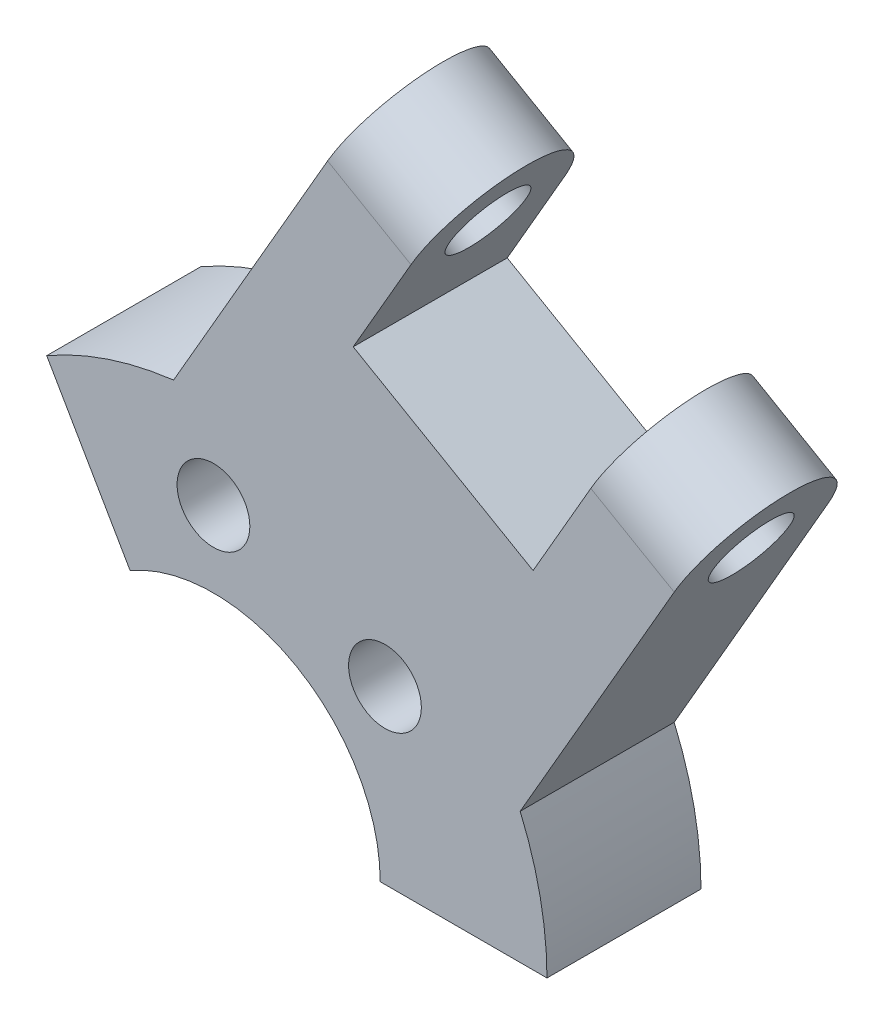
ISO-10303-21;
HEADER;
FILE_DESCRIPTION(('STEP AP214'),'2;1');
FILE_NAME('part.step','',(''),(''),'','','');
FILE_SCHEMA(('AUTOMOTIVE_DESIGN { 1 0 10303 214 1 1 1 1 }'));
ENDSEC;
DATA;
#1=APPLICATION_CONTEXT('core data for automotive mechanical design processes');
#2=APPLICATION_PROTOCOL_DEFINITION('international standard','automotive_design',2000,#1);
#3=PRODUCT_CONTEXT('',#1,'mechanical');
#4=PRODUCT('Part','Part','',(#3));
#5=PRODUCT_RELATED_PRODUCT_CATEGORY('part','',(#4));
#6=PRODUCT_DEFINITION_FORMATION('','',#4);
#7=PRODUCT_DEFINITION_CONTEXT('part definition',#1,'design');
#8=PRODUCT_DEFINITION('design','',#6,#7);
#9=PRODUCT_DEFINITION_SHAPE('','',#8);
#10=(LENGTH_UNIT() NAMED_UNIT(*) SI_UNIT(.MILLI.,.METRE.));
#11=(NAMED_UNIT(*) PLANE_ANGLE_UNIT() SI_UNIT($,.RADIAN.));
#12=(NAMED_UNIT(*) SI_UNIT($,.STERADIAN.) SOLID_ANGLE_UNIT());
#13=UNCERTAINTY_MEASURE_WITH_UNIT(LENGTH_MEASURE(1.E-05),#10,'distance_accuracy_value','');
#14=(GEOMETRIC_REPRESENTATION_CONTEXT(3) GLOBAL_UNCERTAINTY_ASSIGNED_CONTEXT((#13)) GLOBAL_UNIT_ASSIGNED_CONTEXT((#10,
#11,#12)) REPRESENTATION_CONTEXT('',''));
#15=CARTESIAN_POINT('',(0.,0.,0.));
#16=DIRECTION('',(0.,0.,1.));
#17=DIRECTION('',(1.,0.,0.));
#18=AXIS2_PLACEMENT_3D('',#15,#16,#17);
#19=CARTESIAN_POINT('',(0.,0.,10.17));
#20=DIRECTION('',(0.,-1.,0.));
#21=DIRECTION('',(0.,0.,-1.));
#22=AXIS2_PLACEMENT_3D('',#19,#20,#21);
#23=PLANE('',#22);
#24=DIRECTION('',(1.,0.,0.));
#25=VECTOR('',#24,1.);
#26=CARTESIAN_POINT('',(0.,0.,10.16));
#27=LINE('',#26,#25);
#28=CARTESIAN_POINT('',(11.,0.,10.16));
#29=VERTEX_POINT('',#28);
#30=CARTESIAN_POINT('',(22.,0.,10.16));
#31=VERTEX_POINT('',#30);
#32=EDGE_CURVE('E134',#29,#31,#27,.T.);
#33=ORIENTED_EDGE('',*,*,#32,.F.);
#34=DIRECTION('',(0.,0.,1.));
#35=VECTOR('',#34,1.);
#36=CARTESIAN_POINT('',(11.,0.,0.));
#37=LINE('',#36,#35);
#38=CARTESIAN_POINT('',(11.,0.,0.));
#39=VERTEX_POINT('',#38);
#40=EDGE_CURVE('E147',#29,#39,#37,.F.);
#41=ORIENTED_EDGE('',*,*,#40,.T.);
#42=DIRECTION('',(1.,0.,0.));
#43=VECTOR('',#42,1.);
#44=CARTESIAN_POINT('',(0.,0.,0.));
#45=LINE('',#44,#43);
#46=CARTESIAN_POINT('',(22.,0.,0.));
#47=VERTEX_POINT('',#46);
#48=EDGE_CURVE('E150',#39,#47,#45,.T.);
#49=ORIENTED_EDGE('',*,*,#48,.T.);
#50=DIRECTION('',(0.,0.,-1.));
#51=VECTOR('',#50,1.);
#52=CARTESIAN_POINT('',(22.,0.,10.16));
#53=LINE('',#52,#51);
#54=EDGE_CURVE('E149',#47,#31,#53,.F.);
#55=ORIENTED_EDGE('',*,*,#54,.T.);
#56=EDGE_LOOP('',(#33,#41,#49,#55));
#57=FACE_BOUND('',#56,.T.);
#58=ADVANCED_FACE('F35',(#57),#23,.T.);
#59=CARTESIAN_POINT('',(0.,0.,10.17));
#60=DIRECTION('',(-0.866025403784443,-0.499999999999993,0.));
#61=DIRECTION('',(0.499999999999993,-0.866025403784443,0.));
#62=AXIS2_PLACEMENT_3D('',#59,#60,#61);
#63=PLANE('',#62);
#64=DIRECTION('',(0.499999999999993,-0.866025403784443,0.));
#65=VECTOR('',#64,1.);
#66=CARTESIAN_POINT('',(0.,0.,10.16));
#67=LINE('',#66,#65);
#68=CARTESIAN_POINT('',(-10.9999999999998,19.0525588832577,10.16));
#69=VERTEX_POINT('',#68);
#70=CARTESIAN_POINT('',(-5.49999999999992,9.52627944162887,10.16));
#71=VERTEX_POINT('',#70);
#72=EDGE_CURVE('E137',#69,#71,#67,.T.);
#73=ORIENTED_EDGE('',*,*,#72,.F.);
#74=DIRECTION('',(0.,0.,-1.));
#75=VECTOR('',#74,1.);
#76=CARTESIAN_POINT('',(-10.9999999999998,19.0525588832577,10.16));
#77=LINE('',#76,#75);
#78=CARTESIAN_POINT('',(-10.9999999999998,19.0525588832577,0.));
#79=VERTEX_POINT('',#78);
#80=EDGE_CURVE('E153',#69,#79,#77,.T.);
#81=ORIENTED_EDGE('',*,*,#80,.T.);
#82=DIRECTION('',(0.499999999999993,-0.866025403784443,0.));
#83=VECTOR('',#82,1.);
#84=CARTESIAN_POINT('',(0.,0.,0.));
#85=LINE('',#84,#83);
#86=CARTESIAN_POINT('',(-5.49999999999992,9.52627944162887,0.));
#87=VERTEX_POINT('',#86);
#88=EDGE_CURVE('E186',#79,#87,#85,.T.);
#89=ORIENTED_EDGE('',*,*,#88,.T.);
#90=DIRECTION('',(0.,0.,1.));
#91=VECTOR('',#90,1.);
#92=CARTESIAN_POINT('',(-5.49999999999992,9.52627944162887,0.));
#93=LINE('',#92,#91);
#94=EDGE_CURVE('E154',#87,#71,#93,.T.);
#95=ORIENTED_EDGE('',*,*,#94,.T.);
#96=EDGE_LOOP('',(#73,#81,#89,#95));
#97=FACE_BOUND('',#96,.T.);
#98=ADVANCED_FACE('F177',(#97),#63,.T.);
#99=CARTESIAN_POINT('',(0.,0.,10.16));
#100=DIRECTION('',(0.,0.,1.));
#101=DIRECTION('',(1.,0.,0.));
#102=AXIS2_PLACEMENT_3D('',#99,#100,#101);
#103=PLANE('',#102);
#104=CARTESIAN_POINT('',(11.3137084989848,11.3137084989847,10.16));
#105=DIRECTION('',(0.,0.,1.));
#106=DIRECTION('',(1.,0.,0.));
#107=AXIS2_PLACEMENT_3D('',#104,#105,#106);
#108=CIRCLE('',#107,2.4);
#109=CARTESIAN_POINT('',(13.7137084989848,11.3137084989847,10.16));
#110=VERTEX_POINT('',#109);
#111=EDGE_CURVE('E143',#110,#110,#108,.T.);
#112=ORIENTED_EDGE('',*,*,#111,.F.);
#113=EDGE_LOOP('',(#112));
#114=FACE_BOUND('',#113,.T.);
#115=CARTESIAN_POINT('',(0.,16.,10.16));
#116=DIRECTION('',(0.,0.,1.));
#117=DIRECTION('',(1.,0.,0.));
#118=AXIS2_PLACEMENT_3D('',#115,#116,#117);
#119=CIRCLE('',#118,2.4);
#120=CARTESIAN_POINT('',(2.4,16.,10.16));
#121=VERTEX_POINT('',#120);
#122=EDGE_CURVE('E169',#121,#121,#119,.T.);
#123=ORIENTED_EDGE('',*,*,#122,.F.);
#124=EDGE_LOOP('',(#123));
#125=FACE_BOUND('',#124,.T.);
#126=CARTESIAN_POINT('',(0.,0.,10.16));
#127=DIRECTION('',(0.,0.,1.));
#128=DIRECTION('',(1.,0.,0.));
#129=AXIS2_PLACEMENT_3D('',#126,#127,#128);
#130=CIRCLE('',#129,11.);
#131=EDGE_CURVE('E131',#29,#71,#130,.T.);
#132=ORIENTED_EDGE('',*,*,#131,.F.);
#133=ORIENTED_EDGE('',*,*,#32,.T.);
#134=CARTESIAN_POINT('',(0.,0.,10.16));
#135=DIRECTION('',(0.,0.,1.));
#136=DIRECTION('',(1.,0.,0.));
#137=AXIS2_PLACEMENT_3D('',#134,#135,#136);
#138=CIRCLE('',#137,22.);
#139=CARTESIAN_POINT('',(20.2315353299547,8.64204710660591,10.16));
#140=VERTEX_POINT('',#139);
#141=EDGE_CURVE('E161',#31,#140,#138,.T.);
#142=ORIENTED_EDGE('',*,*,#141,.T.);
#143=DIRECTION('',(0.500000000000001,0.866025403784438,0.));
#144=VECTOR('',#143,1.);
#145=CARTESIAN_POINT('',(20.2315353299547,8.64204710660592,10.16));
#146=LINE('',#145,#144);
#147=CARTESIAN_POINT('',(30.3915353299548,26.2396833115059,10.16));
#148=VERTEX_POINT('',#147);
#149=EDGE_CURVE('E229',#140,#148,#146,.T.);
#150=ORIENTED_EDGE('',*,*,#149,.T.);
#151=DIRECTION('',(-0.866025403784438,0.500000000000001,0.));
#152=VECTOR('',#151,1.);
#153=CARTESIAN_POINT('',(97.4975582062715,-12.5039970603808,10.16));
#154=LINE('',#153,#152);
#155=CARTESIAN_POINT('',(24.8922740159236,29.4146833115059,10.16));
#156=VERTEX_POINT('',#155);
#157=EDGE_CURVE('E195',#148,#156,#154,.T.);
#158=ORIENTED_EDGE('',*,*,#157,.T.);
#159=DIRECTION('',(-0.500000000000004,-0.866025403784436,0.));
#160=VECTOR('',#159,1.);
#161=CARTESIAN_POINT('',(27.4322740159236,33.8140923627308,10.16));
#162=LINE('',#161,#160);
#163=CARTESIAN_POINT('',(21.0822740159236,22.8155697346685,10.16));
#164=VERTEX_POINT('',#163);
#165=EDGE_CURVE('E227',#156,#164,#162,.T.);
#166=ORIENTED_EDGE('',*,*,#165,.T.);
#167=DIRECTION('',(0.866025403784436,-0.500000000000004,0.));
#168=VECTOR('',#167,1.);
#169=CARTESIAN_POINT('',(9.21772598407677,29.6655697346685,10.16));
#170=LINE('',#169,#168);
#171=CARTESIAN_POINT('',(9.21772598407677,29.6655697346685,10.16));
#172=VERTEX_POINT('',#171);
#173=EDGE_CURVE('E224',#172,#164,#170,.T.);
#174=ORIENTED_EDGE('',*,*,#173,.F.);
#175=DIRECTION('',(-0.500000000000004,-0.866025403784436,0.));
#176=VECTOR('',#175,1.);
#177=CARTESIAN_POINT('',(15.5677259840768,40.6640923627309,10.16));
#178=LINE('',#177,#176);
#179=CARTESIAN_POINT('',(13.0277259840768,36.2646833115059,10.16));
#180=VERTEX_POINT('',#179);
#181=EDGE_CURVE('E222',#180,#172,#178,.T.);
#182=ORIENTED_EDGE('',*,*,#181,.F.);
#183=CARTESIAN_POINT('',(7.52846467004565,39.4396833115059,10.16));
#184=VERTEX_POINT('',#183);
#185=EDGE_CURVE('E197',#180,#184,#154,.T.);
#186=ORIENTED_EDGE('',*,*,#185,.T.);
#187=DIRECTION('',(0.500000000000001,0.866025403784438,0.));
#188=VECTOR('',#187,1.);
#189=CARTESIAN_POINT('',(-2.63153532995437,21.8420471066062,10.16));
#190=LINE('',#189,#188);
#191=CARTESIAN_POINT('',(-2.63153532995437,21.8420471066061,10.16));
#192=VERTEX_POINT('',#191);
#193=EDGE_CURVE('E171',#192,#184,#190,.T.);
#194=ORIENTED_EDGE('',*,*,#193,.F.);
#195=EDGE_CURVE('E163',#192,#69,#138,.T.);
#196=ORIENTED_EDGE('',*,*,#195,.T.);
#197=ORIENTED_EDGE('',*,*,#72,.T.);
#198=EDGE_LOOP('',(#132,#133,#142,#150,#158,#166,#174,#182,#186,#194,#196,#197));
#199=FACE_BOUND('',#198,.T.);
#200=ADVANCED_FACE('F133',(#114,#125,#199),#103,.T.);
#201=CARTESIAN_POINT('',(0.,0.,0.));
#202=DIRECTION('',(0.,0.,1.));
#203=DIRECTION('',(1.,0.,0.));
#204=AXIS2_PLACEMENT_3D('',#201,#202,#203);
#205=PLANE('',#204);
#206=CARTESIAN_POINT('',(11.3137084989848,11.3137084989847,0.));
#207=DIRECTION('',(0.,0.,1.));
#208=DIRECTION('',(1.,0.,0.));
#209=AXIS2_PLACEMENT_3D('',#206,#207,#208);
#210=CIRCLE('',#209,2.4);
#211=CARTESIAN_POINT('',(13.7137084989848,11.3137084989847,0.));
#212=VERTEX_POINT('',#211);
#213=EDGE_CURVE('E244',#212,#212,#210,.T.);
#214=ORIENTED_EDGE('',*,*,#213,.T.);
#215=EDGE_LOOP('',(#214));
#216=FACE_BOUND('',#215,.T.);
#217=CARTESIAN_POINT('',(0.,16.,0.));
#218=DIRECTION('',(0.,0.,1.));
#219=DIRECTION('',(1.,0.,0.));
#220=AXIS2_PLACEMENT_3D('',#217,#218,#219);
#221=CIRCLE('',#220,2.4);
#222=CARTESIAN_POINT('',(2.4,16.,0.));
#223=VERTEX_POINT('',#222);
#224=EDGE_CURVE('E142',#223,#223,#221,.T.);
#225=ORIENTED_EDGE('',*,*,#224,.T.);
#226=EDGE_LOOP('',(#225));
#227=FACE_BOUND('',#226,.T.);
#228=ORIENTED_EDGE('',*,*,#48,.F.);
#229=CARTESIAN_POINT('',(0.,0.,0.));
#230=DIRECTION('',(0.,0.,1.));
#231=DIRECTION('',(1.,0.,0.));
#232=AXIS2_PLACEMENT_3D('',#229,#230,#231);
#233=CIRCLE('',#232,11.);
#234=EDGE_CURVE('E39',#39,#87,#233,.T.);
#235=ORIENTED_EDGE('',*,*,#234,.T.);
#236=ORIENTED_EDGE('',*,*,#88,.F.);
#237=CARTESIAN_POINT('',(0.,0.,0.));
#238=DIRECTION('',(0.,0.,1.));
#239=DIRECTION('',(1.,0.,0.));
#240=AXIS2_PLACEMENT_3D('',#237,#238,#239);
#241=CIRCLE('',#240,22.);
#242=CARTESIAN_POINT('',(-2.63153532995437,21.8420471066062,0.));
#243=VERTEX_POINT('',#242);
#244=EDGE_CURVE('E165',#243,#79,#241,.T.);
#245=ORIENTED_EDGE('',*,*,#244,.F.);
#246=DIRECTION('',(-0.500000000000001,-0.866025403784438,0.));
#247=VECTOR('',#246,1.);
#248=CARTESIAN_POINT('',(-2.63153532995437,21.8420471066062,0.));
#249=LINE('',#248,#247);
#250=CARTESIAN_POINT('',(7.52846467004564,39.4396833115059,0.));
#251=VERTEX_POINT('',#250);
#252=EDGE_CURVE('E218',#251,#243,#249,.T.);
#253=ORIENTED_EDGE('',*,*,#252,.F.);
#254=DIRECTION('',(-0.866025403784438,0.500000000000001,0.));
#255=VECTOR('',#254,1.);
#256=CARTESIAN_POINT('',(97.4975582062715,-12.5039970603808,0.));
#257=LINE('',#256,#255);
#258=CARTESIAN_POINT('',(13.0277259840768,36.2646833115059,0.));
#259=VERTEX_POINT('',#258);
#260=EDGE_CURVE('E193',#259,#251,#257,.T.);
#261=ORIENTED_EDGE('',*,*,#260,.F.);
#262=DIRECTION('',(0.500000000000004,0.866025403784436,0.));
#263=VECTOR('',#262,1.);
#264=CARTESIAN_POINT('',(15.5677259840768,40.6640923627309,0.));
#265=LINE('',#264,#263);
#266=CARTESIAN_POINT('',(9.21772598407677,29.6655697346685,0.));
#267=VERTEX_POINT('',#266);
#268=EDGE_CURVE('E215',#267,#259,#265,.T.);
#269=ORIENTED_EDGE('',*,*,#268,.F.);
#270=DIRECTION('',(-0.866025403784436,0.500000000000004,0.));
#271=VECTOR('',#270,1.);
#272=CARTESIAN_POINT('',(9.21772598407677,29.6655697346685,0.));
#273=LINE('',#272,#271);
#274=CARTESIAN_POINT('',(21.0822740159235,22.8155697346685,0.));
#275=VERTEX_POINT('',#274);
#276=EDGE_CURVE('E212',#275,#267,#273,.T.);
#277=ORIENTED_EDGE('',*,*,#276,.F.);
#278=DIRECTION('',(0.500000000000004,0.866025403784436,0.));
#279=VECTOR('',#278,1.);
#280=CARTESIAN_POINT('',(27.4322740159236,33.8140923627308,0.));
#281=LINE('',#280,#279);
#282=CARTESIAN_POINT('',(24.8922740159236,29.4146833115059,0.));
#283=VERTEX_POINT('',#282);
#284=EDGE_CURVE('E209',#275,#283,#281,.T.);
#285=ORIENTED_EDGE('',*,*,#284,.T.);
#286=CARTESIAN_POINT('',(30.3915353299548,26.2396833115059,0.));
#287=VERTEX_POINT('',#286);
#288=EDGE_CURVE('E198',#287,#283,#257,.T.);
#289=ORIENTED_EDGE('',*,*,#288,.F.);
#290=DIRECTION('',(-0.500000000000001,-0.866025403784438,0.));
#291=VECTOR('',#290,1.);
#292=CARTESIAN_POINT('',(20.2315353299547,8.64204710660592,0.));
#293=LINE('',#292,#291);
#294=CARTESIAN_POINT('',(20.2315353299547,8.64204710660591,0.));
#295=VERTEX_POINT('',#294);
#296=EDGE_CURVE('E220',#287,#295,#293,.T.);
#297=ORIENTED_EDGE('',*,*,#296,.T.);
#298=EDGE_CURVE('E164',#47,#295,#241,.T.);
#299=ORIENTED_EDGE('',*,*,#298,.F.);
#300=EDGE_LOOP('',(#228,#235,#236,#245,#253,#261,#269,#277,#285,#289,#297,#299));
#301=FACE_BOUND('',#300,.T.);
#302=ADVANCED_FACE('F187',(#216,#227,#301),#205,.F.);
#303=CARTESIAN_POINT('',(0.,0.,10.16));
#304=DIRECTION('',(0.,0.,-1.));
#305=DIRECTION('',(-1.,0.,0.));
#306=AXIS2_PLACEMENT_3D('',#303,#304,#305);
#307=CYLINDRICAL_SURFACE('',#306,22.);
#308=ORIENTED_EDGE('',*,*,#54,.F.);
#309=ORIENTED_EDGE('',*,*,#298,.T.);
#310=DIRECTION('',(0.,0.,1.));
#311=VECTOR('',#310,1.);
#312=CARTESIAN_POINT('',(20.2315353299547,8.64204710660592,-50.0356272022586));
#313=LINE('',#312,#311);
#314=EDGE_CURVE('E232',#295,#140,#313,.T.);
#315=ORIENTED_EDGE('',*,*,#314,.T.);
#316=ORIENTED_EDGE('',*,*,#141,.F.);
#317=EDGE_LOOP('',(#308,#309,#315,#316));
#318=FACE_BOUND('',#317,.T.);
#319=ADVANCED_FACE('F258',(#318),#307,.T.);
#320=ORIENTED_EDGE('',*,*,#80,.F.);
#321=ORIENTED_EDGE('',*,*,#195,.F.);
#322=DIRECTION('',(0.,0.,1.));
#323=VECTOR('',#322,1.);
#324=CARTESIAN_POINT('',(-2.63153532995437,21.8420471066062,-50.0356272022586));
#325=LINE('',#324,#323);
#326=EDGE_CURVE('E183',#243,#192,#325,.T.);
#327=ORIENTED_EDGE('',*,*,#326,.F.);
#328=ORIENTED_EDGE('',*,*,#244,.T.);
#329=EDGE_LOOP('',(#320,#321,#327,#328));
#330=FACE_BOUND('',#329,.T.);
#331=ADVANCED_FACE('F180',(#330),#307,.T.);
#332=CARTESIAN_POINT('',(0.,0.,0.));
#333=DIRECTION('',(0.,0.,1.));
#334=DIRECTION('',(1.,0.,0.));
#335=AXIS2_PLACEMENT_3D('',#332,#333,#334);
#336=CYLINDRICAL_SURFACE('',#335,11.);
#337=ORIENTED_EDGE('',*,*,#40,.F.);
#338=ORIENTED_EDGE('',*,*,#131,.T.);
#339=ORIENTED_EDGE('',*,*,#94,.F.);
#340=ORIENTED_EDGE('',*,*,#234,.F.);
#341=EDGE_LOOP('',(#337,#338,#339,#340));
#342=FACE_BOUND('',#341,.T.);
#343=ADVANCED_FACE('F37',(#342),#336,.F.);
#344=CARTESIAN_POINT('',(-2.63153532995437,21.8420471066062,-50.0356272022586));
#345=DIRECTION('',(0.866025403784438,-0.500000000000001,0.));
#346=DIRECTION('',(0.500000000000001,0.866025403784438,0.));
#347=AXIS2_PLACEMENT_3D('',#344,#345,#346);
#348=PLANE('',#347);
#349=CARTESIAN_POINT('',(7.52846467004565,39.4396833115059,5.08));
#350=DIRECTION('',(-0.866025403784438,0.500000000000001,0.));
#351=DIRECTION('',(-0.500000000000001,-0.866025403784438,0.));
#352=AXIS2_PLACEMENT_3D('',#349,#350,#351);
#353=CIRCLE('',#352,2.54);
#354=CARTESIAN_POINT('',(6.25846467004564,37.2399787858935,5.08));
#355=VERTEX_POINT('',#354);
#356=EDGE_CURVE('E11',#355,#355,#353,.T.);
#357=ORIENTED_EDGE('',*,*,#356,.F.);
#358=EDGE_LOOP('',(#357));
#359=FACE_BOUND('',#358,.T.);
#360=CARTESIAN_POINT('',(7.52846467004565,39.4396833115059,5.08));
#361=DIRECTION('',(-0.866025403784438,0.500000000000001,0.));
#362=DIRECTION('',(-0.500000000000001,-0.866025403784438,0.));
#363=AXIS2_PLACEMENT_3D('',#360,#361,#362);
#364=CIRCLE('',#363,5.08);
#365=EDGE_CURVE('E53',#184,#251,#364,.T.);
#366=ORIENTED_EDGE('',*,*,#365,.T.);
#367=ORIENTED_EDGE('',*,*,#252,.T.);
#368=ORIENTED_EDGE('',*,*,#326,.T.);
#369=ORIENTED_EDGE('',*,*,#193,.T.);
#370=EDGE_LOOP('',(#366,#367,#368,#369));
#371=FACE_BOUND('',#370,.T.);
#372=ADVANCED_FACE('F295',(#359,#371),#348,.F.);
#373=CARTESIAN_POINT('',(15.5677259840768,40.6640923627309,-50.0356272022586));
#374=DIRECTION('',(-0.866025403784436,0.500000000000004,0.));
#375=DIRECTION('',(-0.500000000000004,-0.866025403784436,0.));
#376=AXIS2_PLACEMENT_3D('',#373,#374,#375);
#377=PLANE('',#376);
#378=CARTESIAN_POINT('',(13.0277259840768,36.2646833115059,5.08));
#379=DIRECTION('',(-0.866025403784436,0.500000000000004,0.));
#380=DIRECTION('',(-0.500000000000004,-0.866025403784436,0.));
#381=AXIS2_PLACEMENT_3D('',#378,#379,#380);
#382=CIRCLE('',#381,2.54);
#383=CARTESIAN_POINT('',(11.7577259840768,34.0649787858935,5.08));
#384=VERTEX_POINT('',#383);
#385=EDGE_CURVE('E206',#384,#384,#382,.T.);
#386=ORIENTED_EDGE('',*,*,#385,.T.);
#387=EDGE_LOOP('',(#386));
#388=FACE_BOUND('',#387,.T.);
#389=CARTESIAN_POINT('',(13.0277259840768,36.2646833115059,5.08));
#390=DIRECTION('',(-0.866025403784436,0.500000000000004,0.));
#391=DIRECTION('',(-0.500000000000004,-0.866025403784436,0.));
#392=AXIS2_PLACEMENT_3D('',#389,#390,#391);
#393=CIRCLE('',#392,5.08);
#394=EDGE_CURVE('E201',#180,#259,#393,.T.);
#395=ORIENTED_EDGE('',*,*,#394,.F.);
#396=ORIENTED_EDGE('',*,*,#181,.T.);
#397=DIRECTION('',(0.,0.,1.));
#398=VECTOR('',#397,1.);
#399=CARTESIAN_POINT('',(9.21772598407677,29.6655697346685,-50.0356272022586));
#400=LINE('',#399,#398);
#401=EDGE_CURVE('E237',#267,#172,#400,.T.);
#402=ORIENTED_EDGE('',*,*,#401,.F.);
#403=ORIENTED_EDGE('',*,*,#268,.T.);
#404=EDGE_LOOP('',(#395,#396,#402,#403));
#405=FACE_BOUND('',#404,.T.);
#406=ADVANCED_FACE('F298',(#388,#405),#377,.F.);
#407=CARTESIAN_POINT('',(27.4322740159236,33.8140923627308,-50.0356272022586));
#408=DIRECTION('',(-0.866025403784436,0.500000000000004,0.));
#409=DIRECTION('',(-0.500000000000004,-0.866025403784436,0.));
#410=AXIS2_PLACEMENT_3D('',#407,#408,#409);
#411=PLANE('',#410);
#412=CARTESIAN_POINT('',(24.8922740159236,29.4146833115059,5.08));
#413=DIRECTION('',(-0.866025403784436,0.500000000000004,0.));
#414=DIRECTION('',(-0.500000000000004,-0.866025403784436,0.));
#415=AXIS2_PLACEMENT_3D('',#412,#413,#414);
#416=CIRCLE('',#415,2.54);
#417=CARTESIAN_POINT('',(23.6222740159236,27.2149787858934,5.08));
#418=VERTEX_POINT('',#417);
#419=EDGE_CURVE('E203',#418,#418,#416,.T.);
#420=ORIENTED_EDGE('',*,*,#419,.F.);
#421=EDGE_LOOP('',(#420));
#422=FACE_BOUND('',#421,.T.);
#423=ORIENTED_EDGE('',*,*,#165,.F.);
#424=CARTESIAN_POINT('',(24.8922740159236,29.4146833115059,5.08));
#425=DIRECTION('',(-0.866025403784436,0.500000000000004,0.));
#426=DIRECTION('',(-0.500000000000004,-0.866025403784436,0.));
#427=AXIS2_PLACEMENT_3D('',#424,#425,#426);
#428=CIRCLE('',#427,5.08);
#429=EDGE_CURVE('E73',#156,#283,#428,.T.);
#430=ORIENTED_EDGE('',*,*,#429,.T.);
#431=ORIENTED_EDGE('',*,*,#284,.F.);
#432=DIRECTION('',(0.,0.,1.));
#433=VECTOR('',#432,1.);
#434=CARTESIAN_POINT('',(21.0822740159236,22.8155697346685,-50.0356272022586));
#435=LINE('',#434,#433);
#436=EDGE_CURVE('E234',#275,#164,#435,.T.);
#437=ORIENTED_EDGE('',*,*,#436,.T.);
#438=EDGE_LOOP('',(#423,#430,#431,#437));
#439=FACE_BOUND('',#438,.T.);
#440=ADVANCED_FACE('F301',(#422,#439),#411,.T.);
#441=CARTESIAN_POINT('',(20.2315353299547,8.64204710660592,-50.0356272022586));
#442=DIRECTION('',(0.866025403784438,-0.500000000000001,0.));
#443=DIRECTION('',(0.500000000000001,0.866025403784438,0.));
#444=AXIS2_PLACEMENT_3D('',#441,#442,#443);
#445=PLANE('',#444);
#446=CARTESIAN_POINT('',(30.3915353299548,26.2396833115059,5.08));
#447=DIRECTION('',(0.866025403784438,-0.500000000000001,0.));
#448=DIRECTION('',(0.500000000000001,0.866025403784438,0.));
#449=AXIS2_PLACEMENT_3D('',#446,#447,#448);
#450=CIRCLE('',#449,2.54);
#451=CARTESIAN_POINT('',(31.6615353299548,28.4393878371184,5.08));
#452=VERTEX_POINT('',#451);
#453=EDGE_CURVE('E45',#452,#452,#450,.F.);
#454=ORIENTED_EDGE('',*,*,#453,.T.);
#455=EDGE_LOOP('',(#454));
#456=FACE_BOUND('',#455,.T.);
#457=CARTESIAN_POINT('',(30.3915353299548,26.2396833115059,5.08));
#458=DIRECTION('',(0.866025403784438,-0.500000000000001,0.));
#459=DIRECTION('',(0.500000000000001,0.866025403784438,0.));
#460=AXIS2_PLACEMENT_3D('',#457,#458,#459);
#461=CIRCLE('',#460,5.08);
#462=EDGE_CURVE('E68',#287,#148,#461,.T.);
#463=ORIENTED_EDGE('',*,*,#462,.T.);
#464=ORIENTED_EDGE('',*,*,#149,.F.);
#465=ORIENTED_EDGE('',*,*,#314,.F.);
#466=ORIENTED_EDGE('',*,*,#296,.F.);
#467=EDGE_LOOP('',(#463,#464,#465,#466));
#468=FACE_BOUND('',#467,.T.);
#469=ADVANCED_FACE('F254',(#456,#468),#445,.T.);
#470=CARTESIAN_POINT('',(11.3137084989848,11.3137084989847,0.));
#471=DIRECTION('',(0.,0.,1.));
#472=DIRECTION('',(1.,0.,0.));
#473=AXIS2_PLACEMENT_3D('',#470,#471,#472);
#474=CYLINDRICAL_SURFACE('',#473,2.4);
#475=ORIENTED_EDGE('',*,*,#111,.T.);
#476=EDGE_LOOP('',(#475));
#477=FACE_BOUND('',#476,.T.);
#478=ORIENTED_EDGE('',*,*,#213,.F.);
#479=EDGE_LOOP('',(#478));
#480=FACE_BOUND('',#479,.T.);
#481=ADVANCED_FACE('F282',(#477,#480),#474,.F.);
#482=CARTESIAN_POINT('',(0.,16.,0.));
#483=DIRECTION('',(0.,0.,1.));
#484=DIRECTION('',(1.,0.,0.));
#485=AXIS2_PLACEMENT_3D('',#482,#483,#484);
#486=CYLINDRICAL_SURFACE('',#485,2.4);
#487=ORIENTED_EDGE('',*,*,#122,.T.);
#488=EDGE_LOOP('',(#487));
#489=FACE_BOUND('',#488,.T.);
#490=ORIENTED_EDGE('',*,*,#224,.F.);
#491=EDGE_LOOP('',(#490));
#492=FACE_BOUND('',#491,.T.);
#493=ADVANCED_FACE('F278',(#489,#492),#486,.F.);
#494=CARTESIAN_POINT('',(9.21772598407677,29.6655697346685,-50.0356272022586));
#495=DIRECTION('',(-0.500000000000004,-0.866025403784436,0.));
#496=DIRECTION('',(0.866025403784436,-0.500000000000004,0.));
#497=AXIS2_PLACEMENT_3D('',#494,#495,#496);
#498=PLANE('',#497);
#499=ORIENTED_EDGE('',*,*,#436,.F.);
#500=ORIENTED_EDGE('',*,*,#276,.T.);
#501=ORIENTED_EDGE('',*,*,#401,.T.);
#502=ORIENTED_EDGE('',*,*,#173,.T.);
#503=EDGE_LOOP('',(#499,#500,#501,#502));
#504=FACE_BOUND('',#503,.T.);
#505=ADVANCED_FACE('F281',(#504),#498,.F.);
#506=CARTESIAN_POINT('',(97.4975582062715,-12.5039970603808,5.08));
#507=DIRECTION('',(-0.866025403784438,0.500000000000001,0.));
#508=DIRECTION('',(-0.500000000000001,-0.866025403784438,0.));
#509=AXIS2_PLACEMENT_3D('',#506,#507,#508);
#510=CYLINDRICAL_SURFACE('',#509,5.08);
#511=ORIENTED_EDGE('',*,*,#157,.F.);
#512=ORIENTED_EDGE('',*,*,#462,.F.);
#513=ORIENTED_EDGE('',*,*,#288,.T.);
#514=ORIENTED_EDGE('',*,*,#429,.F.);
#515=EDGE_LOOP('',(#511,#512,#513,#514));
#516=FACE_BOUND('',#515,.T.);
#517=ADVANCED_FACE('F256',(#516),#510,.T.);
#518=CARTESIAN_POINT('',(97.4975582062715,-12.5039970603808,5.08));
#519=DIRECTION('',(-0.866025403784438,0.500000000000001,0.));
#520=DIRECTION('',(-0.500000000000001,-0.866025403784438,0.));
#521=AXIS2_PLACEMENT_3D('',#518,#519,#520);
#522=CYLINDRICAL_SURFACE('',#521,2.54);
#523=ORIENTED_EDGE('',*,*,#419,.T.);
#524=EDGE_LOOP('',(#523));
#525=FACE_BOUND('',#524,.T.);
#526=ORIENTED_EDGE('',*,*,#453,.F.);
#527=EDGE_LOOP('',(#526));
#528=FACE_BOUND('',#527,.T.);
#529=ADVANCED_FACE('F314',(#525,#528),#522,.F.);
#530=ORIENTED_EDGE('',*,*,#394,.T.);
#531=ORIENTED_EDGE('',*,*,#260,.T.);
#532=ORIENTED_EDGE('',*,*,#365,.F.);
#533=ORIENTED_EDGE('',*,*,#185,.F.);
#534=EDGE_LOOP('',(#530,#531,#532,#533));
#535=FACE_BOUND('',#534,.T.);
#536=ADVANCED_FACE('F310',(#535),#510,.T.);
#537=ORIENTED_EDGE('',*,*,#356,.T.);
#538=EDGE_LOOP('',(#537));
#539=FACE_BOUND('',#538,.T.);
#540=ORIENTED_EDGE('',*,*,#385,.F.);
#541=EDGE_LOOP('',(#540));
#542=FACE_BOUND('',#541,.T.);
#543=ADVANCED_FACE('F313',(#539,#542),#522,.F.);
#544=CLOSED_SHELL('',(#58,#98,#200,#302,#319,#331,#343,#372,#406,#440,#469,#481,#493,#505,#517,
#529,#536,#543));
#545=MANIFOLD_SOLID_BREP('B2',#544);
#546=ADVANCED_BREP_SHAPE_REPRESENTATION('',(#18,#545),#14);
#547=SHAPE_DEFINITION_REPRESENTATION(#9,#546);
ENDSEC;
END-ISO-10303-21;
